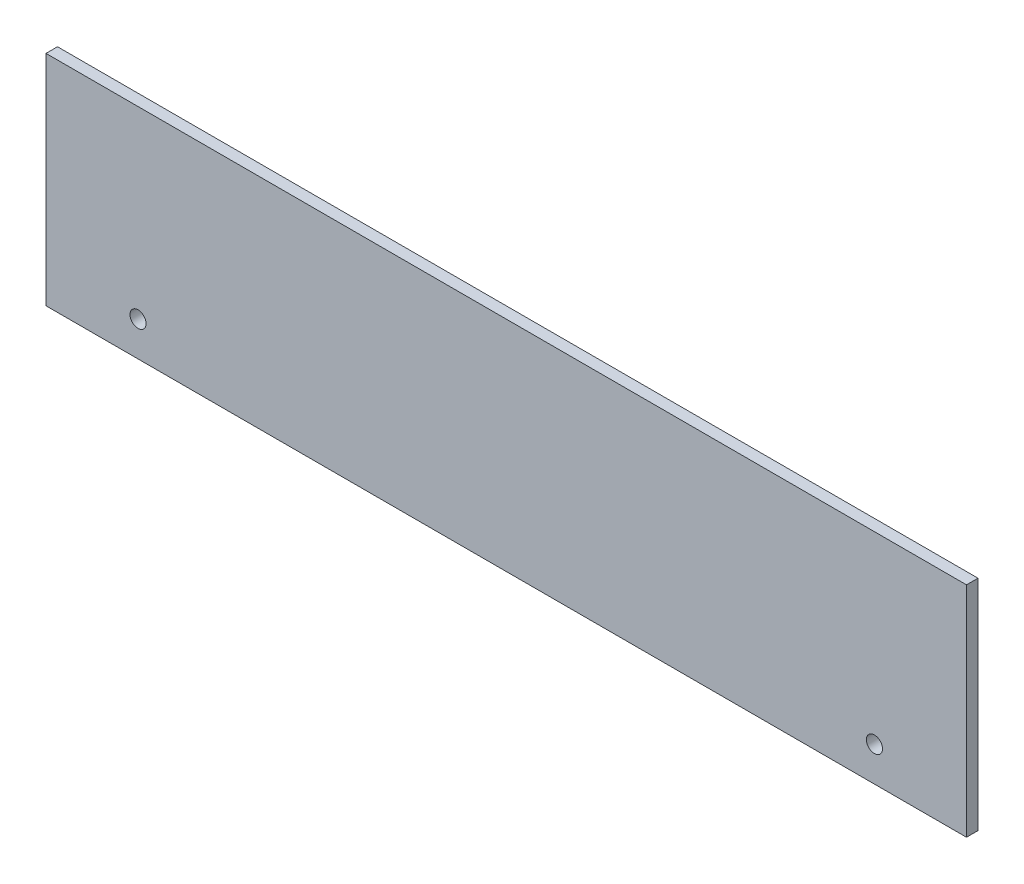
ISO-10303-21;
HEADER;
FILE_DESCRIPTION(('STEP AP214'),'2;1');
FILE_NAME('part.step','',(''),(''),'','','');
FILE_SCHEMA(('AUTOMOTIVE_DESIGN { 1 0 10303 214 1 1 1 1 }'));
ENDSEC;
DATA;
#1=APPLICATION_CONTEXT('core data for automotive mechanical design processes');
#2=APPLICATION_PROTOCOL_DEFINITION('international standard','automotive_design',2000,#1);
#3=PRODUCT_CONTEXT('',#1,'mechanical');
#4=PRODUCT('Part','Part','',(#3));
#5=PRODUCT_RELATED_PRODUCT_CATEGORY('part','',(#4));
#6=PRODUCT_DEFINITION_FORMATION('','',#4);
#7=PRODUCT_DEFINITION_CONTEXT('part definition',#1,'design');
#8=PRODUCT_DEFINITION('design','',#6,#7);
#9=PRODUCT_DEFINITION_SHAPE('','',#8);
#10=(LENGTH_UNIT() NAMED_UNIT(*) SI_UNIT(.MILLI.,.METRE.));
#11=(NAMED_UNIT(*) PLANE_ANGLE_UNIT() SI_UNIT($,.RADIAN.));
#12=(NAMED_UNIT(*) SI_UNIT($,.STERADIAN.) SOLID_ANGLE_UNIT());
#13=UNCERTAINTY_MEASURE_WITH_UNIT(LENGTH_MEASURE(1.E-05),#10,'distance_accuracy_value','');
#14=(GEOMETRIC_REPRESENTATION_CONTEXT(3) GLOBAL_UNCERTAINTY_ASSIGNED_CONTEXT((#13)) GLOBAL_UNIT_ASSIGNED_CONTEXT((#10,
#11,#12)) REPRESENTATION_CONTEXT('',''));
#15=CARTESIAN_POINT('',(0.,0.,0.));
#16=DIRECTION('',(0.,0.,1.));
#17=DIRECTION('',(1.,0.,0.));
#18=AXIS2_PLACEMENT_3D('',#15,#16,#17);
#19=CARTESIAN_POINT('',(0.,0.,5.));
#20=DIRECTION('',(0.,0.,1.));
#21=DIRECTION('',(1.,0.,0.));
#22=AXIS2_PLACEMENT_3D('',#19,#20,#21);
#23=PLANE('',#22);
#24=CARTESIAN_POINT('',(-186.105641951053,-187.952440937329,5.));
#25=DIRECTION('',(0.,0.,1.));
#26=DIRECTION('',(1.,0.,0.));
#27=AXIS2_PLACEMENT_3D('',#24,#25,#26);
#28=CIRCLE('',#27,3.50000000000002);
#29=CARTESIAN_POINT('',(-182.605641951053,-187.952440937329,5.));
#30=VERTEX_POINT('',#29);
#31=EDGE_CURVE('E108',#30,#30,#28,.T.);
#32=ORIENTED_EDGE('',*,*,#31,.F.);
#33=EDGE_LOOP('',(#32));
#34=FACE_BOUND('',#33,.T.);
#35=DIRECTION('',(0.,-1.,0.));
#36=VECTOR('',#35,1.);
#37=CARTESIAN_POINT('',(-226.105641951053,-107.952440937329,5.));
#38=LINE('',#37,#36);
#39=CARTESIAN_POINT('',(-226.105641951053,-107.952440937329,5.));
#40=VERTEX_POINT('',#39);
#41=CARTESIAN_POINT('',(-226.105641951053,-202.952440937329,5.));
#42=VERTEX_POINT('',#41);
#43=EDGE_CURVE('E93',#40,#42,#38,.T.);
#44=ORIENTED_EDGE('',*,*,#43,.T.);
#45=DIRECTION('',(1.,0.,0.));
#46=VECTOR('',#45,1.);
#47=CARTESIAN_POINT('',(-226.105641951053,-202.952440937329,5.));
#48=LINE('',#47,#46);
#49=CARTESIAN_POINT('',(173.894358048947,-202.952440937329,5.));
#50=VERTEX_POINT('',#49);
#51=EDGE_CURVE('E88',#42,#50,#48,.T.);
#52=ORIENTED_EDGE('',*,*,#51,.T.);
#53=DIRECTION('',(0.,1.,0.));
#54=VECTOR('',#53,1.);
#55=CARTESIAN_POINT('',(173.894358048947,-107.952440937329,5.));
#56=LINE('',#55,#54);
#57=CARTESIAN_POINT('',(173.894358048947,-107.952440937329,5.));
#58=VERTEX_POINT('',#57);
#59=EDGE_CURVE('E91',#50,#58,#56,.T.);
#60=ORIENTED_EDGE('',*,*,#59,.T.);
#61=DIRECTION('',(-1.,0.,0.));
#62=VECTOR('',#61,1.);
#63=CARTESIAN_POINT('',(-226.105641951053,-107.952440937329,5.));
#64=LINE('',#63,#62);
#65=EDGE_CURVE('E58',#58,#40,#64,.T.);
#66=ORIENTED_EDGE('',*,*,#65,.T.);
#67=EDGE_LOOP('',(#44,#52,#60,#66));
#68=FACE_BOUND('',#67,.T.);
#69=CARTESIAN_POINT('',(133.894358048947,-187.952440937329,5.));
#70=DIRECTION('',(0.,0.,1.));
#71=DIRECTION('',(-1.,0.,0.));
#72=AXIS2_PLACEMENT_3D('',#69,#70,#71);
#73=CIRCLE('',#72,3.49999999999999);
#74=CARTESIAN_POINT('',(130.394358048947,-187.952440937329,5.));
#75=VERTEX_POINT('',#74);
#76=EDGE_CURVE('E123',#75,#75,#73,.T.);
#77=ORIENTED_EDGE('',*,*,#76,.F.);
#78=EDGE_LOOP('',(#77));
#79=FACE_BOUND('',#78,.T.);
#80=ADVANCED_FACE('F41',(#34,#68,#79),#23,.T.);
#81=CARTESIAN_POINT('',(0.,0.,0.));
#82=DIRECTION('',(0.,0.,1.));
#83=DIRECTION('',(1.,0.,0.));
#84=AXIS2_PLACEMENT_3D('',#81,#82,#83);
#85=PLANE('',#84);
#86=DIRECTION('',(0.,-1.,0.));
#87=VECTOR('',#86,1.);
#88=CARTESIAN_POINT('',(-226.105641951053,-107.952440937329,0.));
#89=LINE('',#88,#87);
#90=CARTESIAN_POINT('',(-226.105641951053,-107.952440937329,0.));
#91=VERTEX_POINT('',#90);
#92=CARTESIAN_POINT('',(-226.105641951053,-202.952440937329,0.));
#93=VERTEX_POINT('',#92);
#94=EDGE_CURVE('E105',#91,#93,#89,.T.);
#95=ORIENTED_EDGE('',*,*,#94,.F.);
#96=DIRECTION('',(-1.,0.,0.));
#97=VECTOR('',#96,1.);
#98=CARTESIAN_POINT('',(-226.105641951053,-107.952440937329,0.));
#99=LINE('',#98,#97);
#100=CARTESIAN_POINT('',(173.894358048947,-107.952440937329,0.));
#101=VERTEX_POINT('',#100);
#102=EDGE_CURVE('E81',#101,#91,#99,.T.);
#103=ORIENTED_EDGE('',*,*,#102,.F.);
#104=DIRECTION('',(0.,1.,0.));
#105=VECTOR('',#104,1.);
#106=CARTESIAN_POINT('',(173.894358048947,-107.952440937329,0.));
#107=LINE('',#106,#105);
#108=CARTESIAN_POINT('',(173.894358048947,-202.952440937329,0.));
#109=VERTEX_POINT('',#108);
#110=EDGE_CURVE('E75',#109,#101,#107,.T.);
#111=ORIENTED_EDGE('',*,*,#110,.F.);
#112=DIRECTION('',(1.,0.,0.));
#113=VECTOR('',#112,1.);
#114=CARTESIAN_POINT('',(121.394358048947,-202.952440937329,0.));
#115=LINE('',#114,#113);
#116=EDGE_CURVE('E97',#93,#109,#115,.T.);
#117=ORIENTED_EDGE('',*,*,#116,.F.);
#118=EDGE_LOOP('',(#95,#103,#111,#117));
#119=FACE_BOUND('',#118,.T.);
#120=CARTESIAN_POINT('',(-186.105641951053,-187.952440937329,0.));
#121=DIRECTION('',(0.,0.,1.));
#122=DIRECTION('',(1.,0.,0.));
#123=AXIS2_PLACEMENT_3D('',#120,#121,#122);
#124=CIRCLE('',#123,3.50000000000002);
#125=CARTESIAN_POINT('',(-182.605641951053,-187.952440937329,0.));
#126=VERTEX_POINT('',#125);
#127=EDGE_CURVE('E120',#126,#126,#124,.T.);
#128=ORIENTED_EDGE('',*,*,#127,.T.);
#129=EDGE_LOOP('',(#128));
#130=FACE_BOUND('',#129,.T.);
#131=CARTESIAN_POINT('',(133.894358048947,-187.952440937329,0.));
#132=DIRECTION('',(0.,0.,1.));
#133=DIRECTION('',(-1.,0.,0.));
#134=AXIS2_PLACEMENT_3D('',#131,#132,#133);
#135=CIRCLE('',#134,3.49999999999999);
#136=CARTESIAN_POINT('',(130.394358048947,-187.952440937329,0.));
#137=VERTEX_POINT('',#136);
#138=EDGE_CURVE('E126',#137,#137,#135,.T.);
#139=ORIENTED_EDGE('',*,*,#138,.T.);
#140=EDGE_LOOP('',(#139));
#141=FACE_BOUND('',#140,.T.);
#142=ADVANCED_FACE('F116',(#119,#130,#141),#85,.F.);
#143=CARTESIAN_POINT('',(-226.105641951053,-107.952440937329,5.));
#144=DIRECTION('',(1.,0.,0.));
#145=DIRECTION('',(0.,0.,-1.));
#146=AXIS2_PLACEMENT_3D('',#143,#144,#145);
#147=PLANE('',#146);
#148=ORIENTED_EDGE('',*,*,#94,.T.);
#149=DIRECTION('',(0.,0.,-1.));
#150=VECTOR('',#149,1.);
#151=CARTESIAN_POINT('',(-226.105641951053,-202.952440937329,5.));
#152=LINE('',#151,#150);
#153=EDGE_CURVE('E11',#42,#93,#152,.T.);
#154=ORIENTED_EDGE('',*,*,#153,.F.);
#155=ORIENTED_EDGE('',*,*,#43,.F.);
#156=DIRECTION('',(0.,0.,-1.));
#157=VECTOR('',#156,1.);
#158=CARTESIAN_POINT('',(-226.105641951053,-107.952440937329,5.));
#159=LINE('',#158,#157);
#160=EDGE_CURVE('E101',#40,#91,#159,.T.);
#161=ORIENTED_EDGE('',*,*,#160,.T.);
#162=EDGE_LOOP('',(#148,#154,#155,#161));
#163=FACE_BOUND('',#162,.T.);
#164=ADVANCED_FACE('F43',(#163),#147,.F.);
#165=CARTESIAN_POINT('',(121.394358048947,-202.952440937329,5.));
#166=DIRECTION('',(0.,1.,0.));
#167=DIRECTION('',(0.,0.,1.));
#168=AXIS2_PLACEMENT_3D('',#165,#166,#167);
#169=PLANE('',#168);
#170=ORIENTED_EDGE('',*,*,#116,.T.);
#171=DIRECTION('',(0.,0.,-1.));
#172=VECTOR('',#171,1.);
#173=CARTESIAN_POINT('',(173.894358048947,-202.952440937329,5.));
#174=LINE('',#173,#172);
#175=EDGE_CURVE('E50',#50,#109,#174,.T.);
#176=ORIENTED_EDGE('',*,*,#175,.F.);
#177=ORIENTED_EDGE('',*,*,#51,.F.);
#178=ORIENTED_EDGE('',*,*,#153,.T.);
#179=EDGE_LOOP('',(#170,#176,#177,#178));
#180=FACE_BOUND('',#179,.T.);
#181=ADVANCED_FACE('F96',(#180),#169,.F.);
#182=CARTESIAN_POINT('',(173.894358048947,-107.952440937329,5.));
#183=DIRECTION('',(-1.,0.,0.));
#184=DIRECTION('',(0.,0.,1.));
#185=AXIS2_PLACEMENT_3D('',#182,#183,#184);
#186=PLANE('',#185);
#187=ORIENTED_EDGE('',*,*,#110,.T.);
#188=DIRECTION('',(0.,0.,-1.));
#189=VECTOR('',#188,1.);
#190=CARTESIAN_POINT('',(173.894358048947,-107.952440937329,5.));
#191=LINE('',#190,#189);
#192=EDGE_CURVE('E98',#58,#101,#191,.T.);
#193=ORIENTED_EDGE('',*,*,#192,.F.);
#194=ORIENTED_EDGE('',*,*,#59,.F.);
#195=ORIENTED_EDGE('',*,*,#175,.T.);
#196=EDGE_LOOP('',(#187,#193,#194,#195));
#197=FACE_BOUND('',#196,.T.);
#198=ADVANCED_FACE('F99',(#197),#186,.F.);
#199=CARTESIAN_POINT('',(-226.105641951053,-107.952440937329,5.));
#200=DIRECTION('',(0.,-1.,0.));
#201=DIRECTION('',(0.,0.,-1.));
#202=AXIS2_PLACEMENT_3D('',#199,#200,#201);
#203=PLANE('',#202);
#204=ORIENTED_EDGE('',*,*,#102,.T.);
#205=ORIENTED_EDGE('',*,*,#160,.F.);
#206=ORIENTED_EDGE('',*,*,#65,.F.);
#207=ORIENTED_EDGE('',*,*,#192,.T.);
#208=EDGE_LOOP('',(#204,#205,#206,#207));
#209=FACE_BOUND('',#208,.T.);
#210=ADVANCED_FACE('F113',(#209),#203,.F.);
#211=CARTESIAN_POINT('',(-186.105641951053,-187.952440937329,5.));
#212=DIRECTION('',(0.,0.,-1.));
#213=DIRECTION('',(-1.,0.,0.));
#214=AXIS2_PLACEMENT_3D('',#211,#212,#213);
#215=CYLINDRICAL_SURFACE('',#214,3.50000000000002);
#216=ORIENTED_EDGE('',*,*,#31,.T.);
#217=EDGE_LOOP('',(#216));
#218=FACE_BOUND('',#217,.T.);
#219=ORIENTED_EDGE('',*,*,#127,.F.);
#220=EDGE_LOOP('',(#219));
#221=FACE_BOUND('',#220,.T.);
#222=ADVANCED_FACE('F143',(#218,#221),#215,.F.);
#223=CARTESIAN_POINT('',(133.894358048947,-187.952440937329,5.));
#224=DIRECTION('',(0.,0.,-1.));
#225=DIRECTION('',(-1.,0.,0.));
#226=AXIS2_PLACEMENT_3D('',#223,#224,#225);
#227=CYLINDRICAL_SURFACE('',#226,3.49999999999999);
#228=ORIENTED_EDGE('',*,*,#76,.T.);
#229=EDGE_LOOP('',(#228));
#230=FACE_BOUND('',#229,.T.);
#231=ORIENTED_EDGE('',*,*,#138,.F.);
#232=EDGE_LOOP('',(#231));
#233=FACE_BOUND('',#232,.T.);
#234=ADVANCED_FACE('F132',(#230,#233),#227,.F.);
#235=CLOSED_SHELL('',(#80,#142,#164,#181,#198,#210,#222,#234));
#236=MANIFOLD_SOLID_BREP('B2',#235);
#237=ADVANCED_BREP_SHAPE_REPRESENTATION('',(#18,#236),#14);
#238=SHAPE_DEFINITION_REPRESENTATION(#9,#237);
ENDSEC;
END-ISO-10303-21;
